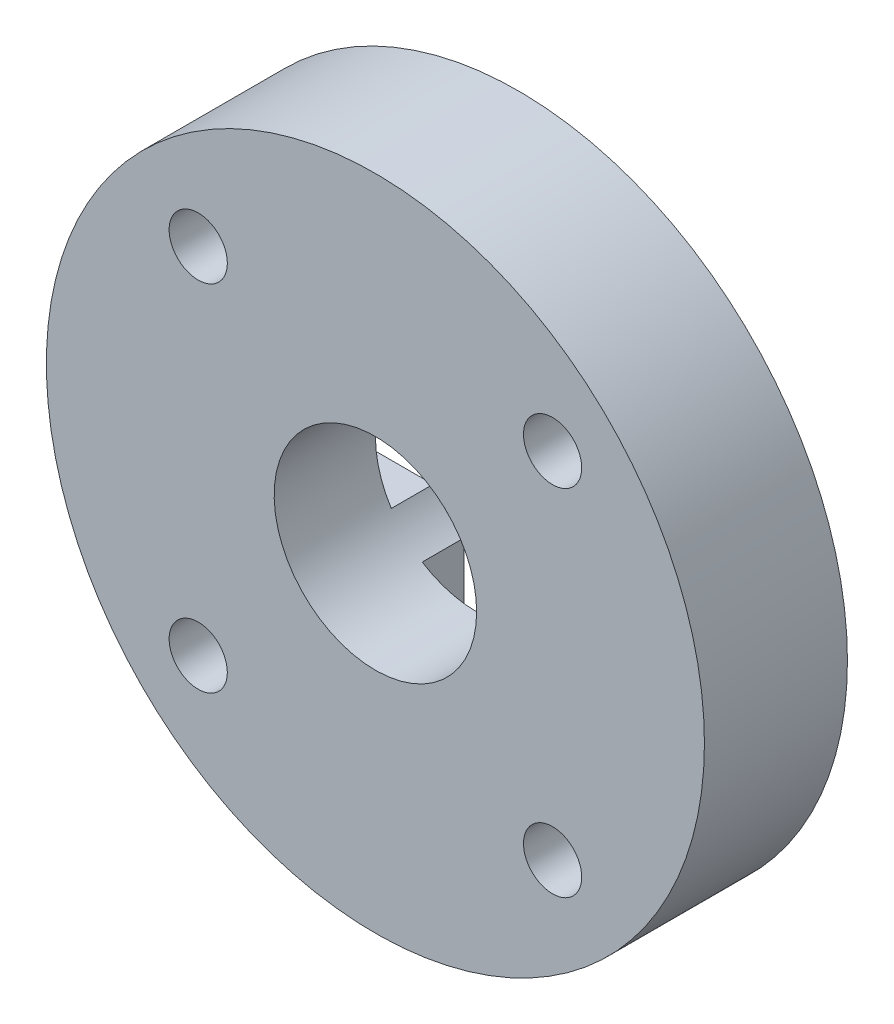
ISO-10303-21;
HEADER;
FILE_DESCRIPTION(('STEP AP214'),'2;1');
FILE_NAME('part.step','',(''),(''),'','','');
FILE_SCHEMA(('AUTOMOTIVE_DESIGN { 1 0 10303 214 1 1 1 1 }'));
ENDSEC;
DATA;
#1=APPLICATION_CONTEXT('core data for automotive mechanical design processes');
#2=APPLICATION_PROTOCOL_DEFINITION('international standard','automotive_design',2000,#1);
#3=PRODUCT_CONTEXT('',#1,'mechanical');
#4=PRODUCT('Part','Part','',(#3));
#5=PRODUCT_RELATED_PRODUCT_CATEGORY('part','',(#4));
#6=PRODUCT_DEFINITION_FORMATION('','',#4);
#7=PRODUCT_DEFINITION_CONTEXT('part definition',#1,'design');
#8=PRODUCT_DEFINITION('design','',#6,#7);
#9=PRODUCT_DEFINITION_SHAPE('','',#8);
#10=(LENGTH_UNIT() NAMED_UNIT(*) SI_UNIT(.MILLI.,.METRE.));
#11=(NAMED_UNIT(*) PLANE_ANGLE_UNIT() SI_UNIT($,.RADIAN.));
#12=(NAMED_UNIT(*) SI_UNIT($,.STERADIAN.) SOLID_ANGLE_UNIT());
#13=UNCERTAINTY_MEASURE_WITH_UNIT(LENGTH_MEASURE(1.E-05),#10,'distance_accuracy_value','');
#14=(GEOMETRIC_REPRESENTATION_CONTEXT(3) GLOBAL_UNCERTAINTY_ASSIGNED_CONTEXT((#13)) GLOBAL_UNIT_ASSIGNED_CONTEXT((#10,
#11,#12)) REPRESENTATION_CONTEXT('',''));
#15=CARTESIAN_POINT('',(0.,0.,0.));
#16=DIRECTION('',(0.,0.,1.));
#17=DIRECTION('',(1.,0.,0.));
#18=AXIS2_PLACEMENT_3D('',#15,#16,#17);
#19=CARTESIAN_POINT('',(0.,0.,-1.65));
#20=DIRECTION('',(0.,0.,1.));
#21=DIRECTION('',(1.,0.,0.));
#22=AXIS2_PLACEMENT_3D('',#19,#20,#21);
#23=PLANE('',#22);
#24=CARTESIAN_POINT('',(7.,-7.,-1.65));
#25=DIRECTION('',(0.,0.,1.));
#26=DIRECTION('',(1.,0.,0.));
#27=AXIS2_PLACEMENT_3D('',#24,#25,#26);
#28=CIRCLE('',#27,1.15);
#29=CARTESIAN_POINT('',(8.15,-7.,-1.65));
#30=VERTEX_POINT('',#29);
#31=EDGE_CURVE('E268',#30,#30,#28,.F.);
#32=ORIENTED_EDGE('',*,*,#31,.F.);
#33=EDGE_LOOP('',(#32));
#34=FACE_BOUND('',#33,.T.);
#35=CARTESIAN_POINT('',(-7.,-7.,-1.65));
#36=DIRECTION('',(0.,0.,1.));
#37=DIRECTION('',(1.,0.,0.));
#38=AXIS2_PLACEMENT_3D('',#35,#36,#37);
#39=CIRCLE('',#38,1.15);
#40=CARTESIAN_POINT('',(-5.85,-7.,-1.65));
#41=VERTEX_POINT('',#40);
#42=EDGE_CURVE('E287',#41,#41,#39,.F.);
#43=ORIENTED_EDGE('',*,*,#42,.F.);
#44=EDGE_LOOP('',(#43));
#45=FACE_BOUND('',#44,.T.);
#46=CARTESIAN_POINT('',(-7.,7.,-1.65));
#47=DIRECTION('',(0.,0.,1.));
#48=DIRECTION('',(1.,0.,0.));
#49=AXIS2_PLACEMENT_3D('',#46,#47,#48);
#50=CIRCLE('',#49,1.15);
#51=CARTESIAN_POINT('',(-5.85,7.,-1.65));
#52=VERTEX_POINT('',#51);
#53=EDGE_CURVE('E291',#52,#52,#50,.F.);
#54=ORIENTED_EDGE('',*,*,#53,.F.);
#55=EDGE_LOOP('',(#54));
#56=FACE_BOUND('',#55,.T.);
#57=CARTESIAN_POINT('',(7.,7.,-1.65));
#58=DIRECTION('',(0.,0.,1.));
#59=DIRECTION('',(1.,0.,0.));
#60=AXIS2_PLACEMENT_3D('',#57,#58,#59);
#61=CIRCLE('',#60,1.15);
#62=CARTESIAN_POINT('',(8.15,7.,-1.65));
#63=VERTEX_POINT('',#62);
#64=EDGE_CURVE('E296',#63,#63,#61,.F.);
#65=ORIENTED_EDGE('',*,*,#64,.F.);
#66=EDGE_LOOP('',(#65));
#67=FACE_BOUND('',#66,.T.);
#68=CARTESIAN_POINT('',(0.,0.,-1.65));
#69=DIRECTION('',(0.,0.,1.));
#70=DIRECTION('',(1.,0.,0.));
#71=AXIS2_PLACEMENT_3D('',#68,#69,#70);
#72=CIRCLE('',#71,13.);
#73=CARTESIAN_POINT('',(13.,0.,-1.65));
#74=VERTEX_POINT('',#73);
#75=EDGE_CURVE('E215',#74,#74,#72,.T.);
#76=ORIENTED_EDGE('',*,*,#75,.F.);
#77=EDGE_LOOP('',(#76));
#78=FACE_BOUND('',#77,.T.);
#79=DIRECTION('',(-1.,0.,0.));
#80=VECTOR('',#79,1.);
#81=CARTESIAN_POINT('',(-8.15,2.15,-1.65));
#82=LINE('',#81,#80);
#83=CARTESIAN_POINT('',(8.15,2.15,-1.65));
#84=VERTEX_POINT('',#83);
#85=CARTESIAN_POINT('',(3.37305499510459,2.15,-1.65));
#86=VERTEX_POINT('',#85);
#87=EDGE_CURVE('E173',#84,#86,#82,.T.);
#88=ORIENTED_EDGE('',*,*,#87,.T.);
#89=CARTESIAN_POINT('',(0.,0.,-1.65));
#90=DIRECTION('',(0.,0.,1.));
#91=DIRECTION('',(1.,0.,0.));
#92=AXIS2_PLACEMENT_3D('',#89,#90,#91);
#93=CIRCLE('',#92,4.);
#94=CARTESIAN_POINT('',(2.15,3.37305499510459,-1.65));
#95=VERTEX_POINT('',#94);
#96=EDGE_CURVE('E154',#86,#95,#93,.T.);
#97=ORIENTED_EDGE('',*,*,#96,.T.);
#98=DIRECTION('',(0.,1.,0.));
#99=VECTOR('',#98,1.);
#100=CARTESIAN_POINT('',(2.15,-8.15,-1.65));
#101=LINE('',#100,#99);
#102=CARTESIAN_POINT('',(2.15,8.15,-1.65));
#103=VERTEX_POINT('',#102);
#104=EDGE_CURVE('E230',#95,#103,#101,.T.);
#105=ORIENTED_EDGE('',*,*,#104,.T.);
#106=CARTESIAN_POINT('',(0.,8.15,-1.65));
#107=DIRECTION('',(0.,0.,1.));
#108=DIRECTION('',(1.,0.,0.));
#109=AXIS2_PLACEMENT_3D('',#106,#107,#108);
#110=CIRCLE('',#109,2.15);
#111=CARTESIAN_POINT('',(-2.15,8.15,-1.65));
#112=VERTEX_POINT('',#111);
#113=EDGE_CURVE('E273',#103,#112,#110,.T.);
#114=ORIENTED_EDGE('',*,*,#113,.T.);
#115=DIRECTION('',(0.,-1.,0.));
#116=VECTOR('',#115,1.);
#117=CARTESIAN_POINT('',(-2.15,-8.15,-1.65));
#118=LINE('',#117,#116);
#119=CARTESIAN_POINT('',(-2.15,3.37305499510459,-1.65));
#120=VERTEX_POINT('',#119);
#121=EDGE_CURVE('E236',#112,#120,#118,.T.);
#122=ORIENTED_EDGE('',*,*,#121,.T.);
#123=CARTESIAN_POINT('',(-3.37305499510459,2.15,-1.65));
#124=VERTEX_POINT('',#123);
#125=EDGE_CURVE('E64',#120,#124,#93,.T.);
#126=ORIENTED_EDGE('',*,*,#125,.T.);
#127=CARTESIAN_POINT('',(-8.15,2.15,-1.65));
#128=VERTEX_POINT('',#127);
#129=EDGE_CURVE('E189',#124,#128,#82,.T.);
#130=ORIENTED_EDGE('',*,*,#129,.T.);
#131=CARTESIAN_POINT('',(-8.15,0.,-1.65));
#132=DIRECTION('',(0.,0.,1.));
#133=DIRECTION('',(1.,0.,0.));
#134=AXIS2_PLACEMENT_3D('',#131,#132,#133);
#135=CIRCLE('',#134,2.15);
#136=CARTESIAN_POINT('',(-8.15,-2.15,-1.65));
#137=VERTEX_POINT('',#136);
#138=EDGE_CURVE('E278',#128,#137,#135,.T.);
#139=ORIENTED_EDGE('',*,*,#138,.T.);
#140=DIRECTION('',(1.,0.,0.));
#141=VECTOR('',#140,1.);
#142=CARTESIAN_POINT('',(-8.15,-2.15,-1.65));
#143=LINE('',#142,#141);
#144=CARTESIAN_POINT('',(-3.37305499510459,-2.15,-1.65));
#145=VERTEX_POINT('',#144);
#146=EDGE_CURVE('E191',#137,#145,#143,.T.);
#147=ORIENTED_EDGE('',*,*,#146,.T.);
#148=CARTESIAN_POINT('',(-2.15,-3.37305499510459,-1.65));
#149=VERTEX_POINT('',#148);
#150=EDGE_CURVE('E636',#145,#149,#93,.T.);
#151=ORIENTED_EDGE('',*,*,#150,.T.);
#152=CARTESIAN_POINT('',(-2.15,-8.15,-1.65));
#153=VERTEX_POINT('',#152);
#154=EDGE_CURVE('E53',#149,#153,#118,.T.);
#155=ORIENTED_EDGE('',*,*,#154,.T.);
#156=CARTESIAN_POINT('',(0.,-8.15,-1.65));
#157=DIRECTION('',(0.,0.,1.));
#158=DIRECTION('',(1.,0.,0.));
#159=AXIS2_PLACEMENT_3D('',#156,#157,#158);
#160=CIRCLE('',#159,2.15);
#161=CARTESIAN_POINT('',(2.15,-8.15,-1.65));
#162=VERTEX_POINT('',#161);
#163=EDGE_CURVE('E270',#153,#162,#160,.T.);
#164=ORIENTED_EDGE('',*,*,#163,.T.);
#165=CARTESIAN_POINT('',(2.15,-3.37305499510459,-1.65));
#166=VERTEX_POINT('',#165);
#167=EDGE_CURVE('E231',#162,#166,#101,.T.);
#168=ORIENTED_EDGE('',*,*,#167,.T.);
#169=CARTESIAN_POINT('',(3.37305499510459,-2.15,-1.65));
#170=VERTEX_POINT('',#169);
#171=EDGE_CURVE('E66',#166,#170,#93,.T.);
#172=ORIENTED_EDGE('',*,*,#171,.T.);
#173=CARTESIAN_POINT('',(8.15,-2.15,-1.65));
#174=VERTEX_POINT('',#173);
#175=EDGE_CURVE('E353',#170,#174,#143,.T.);
#176=ORIENTED_EDGE('',*,*,#175,.T.);
#177=CARTESIAN_POINT('',(8.15,0.,-1.65));
#178=DIRECTION('',(0.,0.,1.));
#179=DIRECTION('',(1.,0.,0.));
#180=AXIS2_PLACEMENT_3D('',#177,#178,#179);
#181=CIRCLE('',#180,2.15);
#182=EDGE_CURVE('E181',#174,#84,#181,.T.);
#183=ORIENTED_EDGE('',*,*,#182,.T.);
#184=EDGE_LOOP('',(#88,#97,#105,#114,#122,#126,#130,#139,#147,#151,#155,#164,#168,#172,#176,#183));
#185=FACE_BOUND('',#184,.T.);
#186=ADVANCED_FACE('F44',(#34,#45,#56,#67,#78,#185),#23,.F.);
#187=CARTESIAN_POINT('',(-8.15,-2.15,0.));
#188=DIRECTION('',(0.,1.,0.));
#189=DIRECTION('',(0.,0.,1.));
#190=AXIS2_PLACEMENT_3D('',#187,#188,#189);
#191=PLANE('',#190);
#192=ORIENTED_EDGE('',*,*,#175,.F.);
#193=DIRECTION('',(0.,0.,-1.));
#194=VECTOR('',#193,1.);
#195=CARTESIAN_POINT('',(3.37305499510459,-2.15,0.));
#196=LINE('',#195,#194);
#197=CARTESIAN_POINT('',(3.37305499510459,-2.15,0.));
#198=VERTEX_POINT('',#197);
#199=EDGE_CURVE('E176',#170,#198,#196,.F.);
#200=ORIENTED_EDGE('',*,*,#199,.T.);
#201=DIRECTION('',(1.,0.,0.));
#202=VECTOR('',#201,1.);
#203=CARTESIAN_POINT('',(-8.15,-2.15,0.));
#204=LINE('',#203,#202);
#205=CARTESIAN_POINT('',(8.15,-2.15,0.));
#206=VERTEX_POINT('',#205);
#207=EDGE_CURVE('E183',#198,#206,#204,.T.);
#208=ORIENTED_EDGE('',*,*,#207,.T.);
#209=DIRECTION('',(0.,0.,-1.));
#210=VECTOR('',#209,1.);
#211=CARTESIAN_POINT('',(8.15,-2.15,0.));
#212=LINE('',#211,#210);
#213=EDGE_CURVE('E204',#206,#174,#212,.T.);
#214=ORIENTED_EDGE('',*,*,#213,.T.);
#215=EDGE_LOOP('',(#192,#200,#208,#214));
#216=FACE_BOUND('',#215,.T.);
#217=ADVANCED_FACE('F409',(#216),#191,.T.);
#218=CARTESIAN_POINT('',(-8.15,2.15,0.));
#219=DIRECTION('',(0.,-1.,0.));
#220=DIRECTION('',(0.,0.,-1.));
#221=AXIS2_PLACEMENT_3D('',#218,#219,#220);
#222=PLANE('',#221);
#223=DIRECTION('',(-1.,0.,0.));
#224=VECTOR('',#223,1.);
#225=CARTESIAN_POINT('',(-8.15,2.15,0.));
#226=LINE('',#225,#224);
#227=CARTESIAN_POINT('',(8.15,2.15,0.));
#228=VERTEX_POINT('',#227);
#229=CARTESIAN_POINT('',(3.37305499510459,2.15,0.));
#230=VERTEX_POINT('',#229);
#231=EDGE_CURVE('E178',#228,#230,#226,.T.);
#232=ORIENTED_EDGE('',*,*,#231,.T.);
#233=DIRECTION('',(0.,0.,-1.));
#234=VECTOR('',#233,1.);
#235=CARTESIAN_POINT('',(3.37305499510459,2.15,0.));
#236=LINE('',#235,#234);
#237=EDGE_CURVE('E159',#230,#86,#236,.T.);
#238=ORIENTED_EDGE('',*,*,#237,.T.);
#239=ORIENTED_EDGE('',*,*,#87,.F.);
#240=DIRECTION('',(0.,0.,-1.));
#241=VECTOR('',#240,1.);
#242=CARTESIAN_POINT('',(8.15,2.15,0.));
#243=LINE('',#242,#241);
#244=EDGE_CURVE('E203',#228,#84,#243,.T.);
#245=ORIENTED_EDGE('',*,*,#244,.F.);
#246=EDGE_LOOP('',(#232,#238,#239,#245));
#247=FACE_BOUND('',#246,.T.);
#248=ADVANCED_FACE('F171',(#247),#222,.T.);
#249=ORIENTED_EDGE('',*,*,#129,.F.);
#250=DIRECTION('',(0.,0.,-1.));
#251=VECTOR('',#250,1.);
#252=CARTESIAN_POINT('',(-3.37305499510459,2.15,0.));
#253=LINE('',#252,#251);
#254=CARTESIAN_POINT('',(-3.37305499510459,2.15,0.));
#255=VERTEX_POINT('',#254);
#256=EDGE_CURVE('E177',#124,#255,#253,.F.);
#257=ORIENTED_EDGE('',*,*,#256,.T.);
#258=CARTESIAN_POINT('',(-8.15,2.15,0.));
#259=VERTEX_POINT('',#258);
#260=EDGE_CURVE('E359',#255,#259,#226,.T.);
#261=ORIENTED_EDGE('',*,*,#260,.T.);
#262=DIRECTION('',(0.,0.,-1.));
#263=VECTOR('',#262,1.);
#264=CARTESIAN_POINT('',(-8.15,2.15,0.));
#265=LINE('',#264,#263);
#266=EDGE_CURVE('E197',#259,#128,#265,.T.);
#267=ORIENTED_EDGE('',*,*,#266,.T.);
#268=EDGE_LOOP('',(#249,#257,#261,#267));
#269=FACE_BOUND('',#268,.T.);
#270=ADVANCED_FACE('F370',(#269),#222,.T.);
#271=CARTESIAN_POINT('',(-8.15,-2.15,0.));
#272=VERTEX_POINT('',#271);
#273=CARTESIAN_POINT('',(-3.37305499510459,-2.15,0.));
#274=VERTEX_POINT('',#273);
#275=EDGE_CURVE('E193',#272,#274,#204,.T.);
#276=ORIENTED_EDGE('',*,*,#275,.T.);
#277=DIRECTION('',(0.,0.,-1.));
#278=VECTOR('',#277,1.);
#279=CARTESIAN_POINT('',(-3.37305499510459,-2.15,0.));
#280=LINE('',#279,#278);
#281=EDGE_CURVE('E321',#274,#145,#280,.T.);
#282=ORIENTED_EDGE('',*,*,#281,.T.);
#283=ORIENTED_EDGE('',*,*,#146,.F.);
#284=DIRECTION('',(0.,0.,-1.));
#285=VECTOR('',#284,1.);
#286=CARTESIAN_POINT('',(-8.15,-2.15,0.));
#287=LINE('',#286,#285);
#288=EDGE_CURVE('E208',#272,#137,#287,.T.);
#289=ORIENTED_EDGE('',*,*,#288,.F.);
#290=EDGE_LOOP('',(#276,#282,#283,#289));
#291=FACE_BOUND('',#290,.T.);
#292=ADVANCED_FACE('F414',(#291),#191,.T.);
#293=CARTESIAN_POINT('',(2.15,-8.15,0.));
#294=DIRECTION('',(-1.,0.,0.));
#295=DIRECTION('',(0.,0.,1.));
#296=AXIS2_PLACEMENT_3D('',#293,#294,#295);
#297=PLANE('',#296);
#298=ORIENTED_EDGE('',*,*,#104,.F.);
#299=DIRECTION('',(0.,0.,-1.));
#300=VECTOR('',#299,1.);
#301=CARTESIAN_POINT('',(2.15,3.37305499510459,0.));
#302=LINE('',#301,#300);
#303=CARTESIAN_POINT('',(2.15,3.37305499510459,0.));
#304=VERTEX_POINT('',#303);
#305=EDGE_CURVE('E165',#95,#304,#302,.F.);
#306=ORIENTED_EDGE('',*,*,#305,.T.);
#307=DIRECTION('',(0.,1.,0.));
#308=VECTOR('',#307,1.);
#309=CARTESIAN_POINT('',(2.15,-8.15,0.));
#310=LINE('',#309,#308);
#311=CARTESIAN_POINT('',(2.15,8.15,0.));
#312=VERTEX_POINT('',#311);
#313=EDGE_CURVE('E257',#304,#312,#310,.T.);
#314=ORIENTED_EDGE('',*,*,#313,.T.);
#315=DIRECTION('',(0.,0.,-1.));
#316=VECTOR('',#315,1.);
#317=CARTESIAN_POINT('',(2.15,8.15,0.));
#318=LINE('',#317,#316);
#319=EDGE_CURVE('E348',#312,#103,#318,.T.);
#320=ORIENTED_EDGE('',*,*,#319,.T.);
#321=EDGE_LOOP('',(#298,#306,#314,#320));
#322=FACE_BOUND('',#321,.T.);
#323=ADVANCED_FACE('F394',(#322),#297,.T.);
#324=CARTESIAN_POINT('',(-2.15,-8.15,0.));
#325=DIRECTION('',(1.,0.,0.));
#326=DIRECTION('',(0.,0.,-1.));
#327=AXIS2_PLACEMENT_3D('',#324,#325,#326);
#328=PLANE('',#327);
#329=DIRECTION('',(0.,-1.,0.));
#330=VECTOR('',#329,1.);
#331=CARTESIAN_POINT('',(-2.15,-8.15,0.));
#332=LINE('',#331,#330);
#333=CARTESIAN_POINT('',(-2.15,8.15,0.));
#334=VERTEX_POINT('',#333);
#335=CARTESIAN_POINT('',(-2.15,3.37305499510459,0.));
#336=VERTEX_POINT('',#335);
#337=EDGE_CURVE('E246',#334,#336,#332,.T.);
#338=ORIENTED_EDGE('',*,*,#337,.T.);
#339=DIRECTION('',(0.,0.,-1.));
#340=VECTOR('',#339,1.);
#341=CARTESIAN_POINT('',(-2.15,3.37305499510459,0.));
#342=LINE('',#341,#340);
#343=EDGE_CURVE('E330',#336,#120,#342,.T.);
#344=ORIENTED_EDGE('',*,*,#343,.T.);
#345=ORIENTED_EDGE('',*,*,#121,.F.);
#346=DIRECTION('',(0.,0.,-1.));
#347=VECTOR('',#346,1.);
#348=CARTESIAN_POINT('',(-2.15,8.15,0.));
#349=LINE('',#348,#347);
#350=EDGE_CURVE('E259',#334,#112,#349,.T.);
#351=ORIENTED_EDGE('',*,*,#350,.F.);
#352=EDGE_LOOP('',(#338,#344,#345,#351));
#353=FACE_BOUND('',#352,.T.);
#354=ADVANCED_FACE('F387',(#353),#328,.T.);
#355=ORIENTED_EDGE('',*,*,#154,.F.);
#356=DIRECTION('',(0.,0.,-1.));
#357=VECTOR('',#356,1.);
#358=CARTESIAN_POINT('',(-2.15,-3.37305499510459,0.));
#359=LINE('',#358,#357);
#360=CARTESIAN_POINT('',(-2.15,-3.37305499510459,0.));
#361=VERTEX_POINT('',#360);
#362=EDGE_CURVE('E170',#149,#361,#359,.F.);
#363=ORIENTED_EDGE('',*,*,#362,.T.);
#364=CARTESIAN_POINT('',(-2.15,-8.15,0.));
#365=VERTEX_POINT('',#364);
#366=EDGE_CURVE('E241',#361,#365,#332,.T.);
#367=ORIENTED_EDGE('',*,*,#366,.T.);
#368=DIRECTION('',(0.,0.,-1.));
#369=VECTOR('',#368,1.);
#370=CARTESIAN_POINT('',(-2.15,-8.15,0.));
#371=LINE('',#370,#369);
#372=EDGE_CURVE('E349',#365,#153,#371,.T.);
#373=ORIENTED_EDGE('',*,*,#372,.T.);
#374=EDGE_LOOP('',(#355,#363,#367,#373));
#375=FACE_BOUND('',#374,.T.);
#376=ADVANCED_FACE('F331',(#375),#328,.T.);
#377=CARTESIAN_POINT('',(2.15,-8.15,0.));
#378=VERTEX_POINT('',#377);
#379=CARTESIAN_POINT('',(2.15,-3.37305499510459,0.));
#380=VERTEX_POINT('',#379);
#381=EDGE_CURVE('E258',#378,#380,#310,.T.);
#382=ORIENTED_EDGE('',*,*,#381,.T.);
#383=DIRECTION('',(0.,0.,-1.));
#384=VECTOR('',#383,1.);
#385=CARTESIAN_POINT('',(2.15,-3.37305499510459,0.));
#386=LINE('',#385,#384);
#387=EDGE_CURVE('E11',#380,#166,#386,.T.);
#388=ORIENTED_EDGE('',*,*,#387,.T.);
#389=ORIENTED_EDGE('',*,*,#167,.F.);
#390=DIRECTION('',(0.,0.,-1.));
#391=VECTOR('',#390,1.);
#392=CARTESIAN_POINT('',(2.15,-8.15,0.));
#393=LINE('',#392,#391);
#394=EDGE_CURVE('E344',#378,#162,#393,.T.);
#395=ORIENTED_EDGE('',*,*,#394,.F.);
#396=EDGE_LOOP('',(#382,#388,#389,#395));
#397=FACE_BOUND('',#396,.T.);
#398=ADVANCED_FACE('F341',(#397),#297,.T.);
#399=CARTESIAN_POINT('',(0.,0.,4.));
#400=DIRECTION('',(0.,0.,1.));
#401=DIRECTION('',(1.,0.,0.));
#402=AXIS2_PLACEMENT_3D('',#399,#400,#401);
#403=PLANE('',#402);
#404=CARTESIAN_POINT('',(7.,-7.,4.));
#405=DIRECTION('',(0.,0.,1.));
#406=DIRECTION('',(1.,0.,0.));
#407=AXIS2_PLACEMENT_3D('',#404,#405,#406);
#408=CIRCLE('',#407,1.15);
#409=CARTESIAN_POINT('',(8.15,-7.,4.));
#410=VERTEX_POINT('',#409);
#411=EDGE_CURVE('E308',#410,#410,#408,.T.);
#412=ORIENTED_EDGE('',*,*,#411,.F.);
#413=EDGE_LOOP('',(#412));
#414=FACE_BOUND('',#413,.T.);
#415=CARTESIAN_POINT('',(-7.,-7.,4.));
#416=DIRECTION('',(0.,0.,1.));
#417=DIRECTION('',(1.,0.,0.));
#418=AXIS2_PLACEMENT_3D('',#415,#416,#417);
#419=CIRCLE('',#418,1.15);
#420=CARTESIAN_POINT('',(-5.85,-7.,4.));
#421=VERTEX_POINT('',#420);
#422=EDGE_CURVE('E309',#421,#421,#419,.T.);
#423=ORIENTED_EDGE('',*,*,#422,.F.);
#424=EDGE_LOOP('',(#423));
#425=FACE_BOUND('',#424,.T.);
#426=CARTESIAN_POINT('',(-7.,7.,4.));
#427=DIRECTION('',(0.,0.,1.));
#428=DIRECTION('',(1.,0.,0.));
#429=AXIS2_PLACEMENT_3D('',#426,#427,#428);
#430=CIRCLE('',#429,1.15);
#431=CARTESIAN_POINT('',(-5.85,7.,4.));
#432=VERTEX_POINT('',#431);
#433=EDGE_CURVE('E304',#432,#432,#430,.T.);
#434=ORIENTED_EDGE('',*,*,#433,.F.);
#435=EDGE_LOOP('',(#434));
#436=FACE_BOUND('',#435,.T.);
#437=CARTESIAN_POINT('',(7.,7.,4.));
#438=DIRECTION('',(0.,0.,1.));
#439=DIRECTION('',(1.,0.,0.));
#440=AXIS2_PLACEMENT_3D('',#437,#438,#439);
#441=CIRCLE('',#440,1.15);
#442=CARTESIAN_POINT('',(8.15,7.,4.));
#443=VERTEX_POINT('',#442);
#444=EDGE_CURVE('E303',#443,#443,#441,.T.);
#445=ORIENTED_EDGE('',*,*,#444,.F.);
#446=EDGE_LOOP('',(#445));
#447=FACE_BOUND('',#446,.T.);
#448=CARTESIAN_POINT('',(0.,0.,4.));
#449=DIRECTION('',(0.,0.,1.));
#450=DIRECTION('',(1.,0.,0.));
#451=AXIS2_PLACEMENT_3D('',#448,#449,#450);
#452=CIRCLE('',#451,13.);
#453=CARTESIAN_POINT('',(13.,0.,4.));
#454=VERTEX_POINT('',#453);
#455=EDGE_CURVE('E225',#454,#454,#452,.T.);
#456=ORIENTED_EDGE('',*,*,#455,.T.);
#457=EDGE_LOOP('',(#456));
#458=FACE_BOUND('',#457,.T.);
#459=CARTESIAN_POINT('',(0.,0.,4.));
#460=DIRECTION('',(0.,0.,1.));
#461=DIRECTION('',(1.,0.,0.));
#462=AXIS2_PLACEMENT_3D('',#459,#460,#461);
#463=CIRCLE('',#462,4.);
#464=CARTESIAN_POINT('',(4.,0.,4.));
#465=VERTEX_POINT('',#464);
#466=EDGE_CURVE('E217',#465,#465,#463,.T.);
#467=ORIENTED_EDGE('',*,*,#466,.F.);
#468=EDGE_LOOP('',(#467));
#469=FACE_BOUND('',#468,.T.);
#470=ADVANCED_FACE('F421',(#414,#425,#436,#447,#458,#469),#403,.T.);
#471=CARTESIAN_POINT('',(0.,0.,4.));
#472=DIRECTION('',(0.,0.,-1.));
#473=DIRECTION('',(-1.,0.,0.));
#474=AXIS2_PLACEMENT_3D('',#471,#472,#473);
#475=CYLINDRICAL_SURFACE('',#474,13.);
#476=ORIENTED_EDGE('',*,*,#455,.F.);
#477=EDGE_LOOP('',(#476));
#478=FACE_BOUND('',#477,.T.);
#479=ORIENTED_EDGE('',*,*,#75,.T.);
#480=EDGE_LOOP('',(#479));
#481=FACE_BOUND('',#480,.T.);
#482=ADVANCED_FACE('F50',(#478,#481),#475,.T.);
#483=CARTESIAN_POINT('',(0.,0.,4.));
#484=DIRECTION('',(0.,0.,-1.));
#485=DIRECTION('',(-1.,0.,0.));
#486=AXIS2_PLACEMENT_3D('',#483,#484,#485);
#487=CYLINDRICAL_SURFACE('',#486,4.);
#488=ORIENTED_EDGE('',*,*,#466,.T.);
#489=EDGE_LOOP('',(#488));
#490=FACE_BOUND('',#489,.T.);
#491=CARTESIAN_POINT('',(0.,0.,0.));
#492=DIRECTION('',(0.,0.,1.));
#493=DIRECTION('',(1.,0.,0.));
#494=AXIS2_PLACEMENT_3D('',#491,#492,#493);
#495=CIRCLE('',#494,4.);
#496=EDGE_CURVE('E224',#304,#336,#495,.T.);
#497=ORIENTED_EDGE('',*,*,#496,.F.);
#498=ORIENTED_EDGE('',*,*,#305,.F.);
#499=ORIENTED_EDGE('',*,*,#96,.F.);
#500=ORIENTED_EDGE('',*,*,#237,.F.);
#501=EDGE_CURVE('E211',#198,#230,#495,.T.);
#502=ORIENTED_EDGE('',*,*,#501,.F.);
#503=ORIENTED_EDGE('',*,*,#199,.F.);
#504=ORIENTED_EDGE('',*,*,#171,.F.);
#505=ORIENTED_EDGE('',*,*,#387,.F.);
#506=EDGE_CURVE('E216',#361,#380,#495,.T.);
#507=ORIENTED_EDGE('',*,*,#506,.F.);
#508=ORIENTED_EDGE('',*,*,#362,.F.);
#509=ORIENTED_EDGE('',*,*,#150,.F.);
#510=ORIENTED_EDGE('',*,*,#281,.F.);
#511=EDGE_CURVE('E220',#255,#274,#495,.T.);
#512=ORIENTED_EDGE('',*,*,#511,.F.);
#513=ORIENTED_EDGE('',*,*,#256,.F.);
#514=ORIENTED_EDGE('',*,*,#125,.F.);
#515=ORIENTED_EDGE('',*,*,#343,.F.);
#516=EDGE_LOOP('',(#497,#498,#499,#500,#502,#503,#504,#505,#507,#508,#509,#510,#512,#513,#514,#515));
#517=FACE_BOUND('',#516,.T.);
#518=ADVANCED_FACE('F158',(#490,#517),#487,.F.);
#519=CARTESIAN_POINT('',(0.,0.,0.));
#520=DIRECTION('',(0.,0.,-1.));
#521=DIRECTION('',(-1.,0.,0.));
#522=AXIS2_PLACEMENT_3D('',#519,#520,#521);
#523=PLANE('',#522);
#524=ORIENTED_EDGE('',*,*,#231,.F.);
#525=CARTESIAN_POINT('',(8.15,0.,0.));
#526=DIRECTION('',(0.,0.,1.));
#527=DIRECTION('',(1.,0.,0.));
#528=AXIS2_PLACEMENT_3D('',#525,#526,#527);
#529=CIRCLE('',#528,2.15);
#530=EDGE_CURVE('E253',#206,#228,#529,.T.);
#531=ORIENTED_EDGE('',*,*,#530,.F.);
#532=ORIENTED_EDGE('',*,*,#207,.F.);
#533=ORIENTED_EDGE('',*,*,#501,.T.);
#534=EDGE_LOOP('',(#524,#531,#532,#533));
#535=FACE_BOUND('',#534,.T.);
#536=ADVANCED_FACE('F423',(#535),#523,.T.);
#537=ORIENTED_EDGE('',*,*,#275,.F.);
#538=CARTESIAN_POINT('',(-8.15,0.,0.));
#539=DIRECTION('',(0.,0.,1.));
#540=DIRECTION('',(1.,0.,0.));
#541=AXIS2_PLACEMENT_3D('',#538,#539,#540);
#542=CIRCLE('',#541,2.15);
#543=EDGE_CURVE('E280',#259,#272,#542,.T.);
#544=ORIENTED_EDGE('',*,*,#543,.F.);
#545=ORIENTED_EDGE('',*,*,#260,.F.);
#546=ORIENTED_EDGE('',*,*,#511,.T.);
#547=EDGE_LOOP('',(#537,#544,#545,#546));
#548=FACE_BOUND('',#547,.T.);
#549=ADVANCED_FACE('F373',(#548),#523,.T.);
#550=CARTESIAN_POINT('',(0.,0.,0.));
#551=DIRECTION('',(0.,0.,-1.));
#552=DIRECTION('',(-1.,0.,0.));
#553=AXIS2_PLACEMENT_3D('',#550,#551,#552);
#554=PLANE('',#553);
#555=ORIENTED_EDGE('',*,*,#337,.F.);
#556=CARTESIAN_POINT('',(0.,8.15,0.));
#557=DIRECTION('',(0.,0.,1.));
#558=DIRECTION('',(1.,0.,0.));
#559=AXIS2_PLACEMENT_3D('',#556,#557,#558);
#560=CIRCLE('',#559,2.15);
#561=EDGE_CURVE('E271',#312,#334,#560,.T.);
#562=ORIENTED_EDGE('',*,*,#561,.F.);
#563=ORIENTED_EDGE('',*,*,#313,.F.);
#564=ORIENTED_EDGE('',*,*,#496,.T.);
#565=EDGE_LOOP('',(#555,#562,#563,#564));
#566=FACE_BOUND('',#565,.T.);
#567=ADVANCED_FACE('F381',(#566),#554,.T.);
#568=ORIENTED_EDGE('',*,*,#381,.F.);
#569=CARTESIAN_POINT('',(0.,-8.15,0.));
#570=DIRECTION('',(0.,0.,1.));
#571=DIRECTION('',(1.,0.,0.));
#572=AXIS2_PLACEMENT_3D('',#569,#570,#571);
#573=CIRCLE('',#572,2.15);
#574=EDGE_CURVE('E262',#365,#378,#573,.T.);
#575=ORIENTED_EDGE('',*,*,#574,.F.);
#576=ORIENTED_EDGE('',*,*,#366,.F.);
#577=ORIENTED_EDGE('',*,*,#506,.T.);
#578=EDGE_LOOP('',(#568,#575,#576,#577));
#579=FACE_BOUND('',#578,.T.);
#580=ADVANCED_FACE('F343',(#579),#554,.T.);
#581=CARTESIAN_POINT('',(0.,-8.15,0.));
#582=DIRECTION('',(0.,0.,-1.));
#583=DIRECTION('',(-1.,0.,0.));
#584=AXIS2_PLACEMENT_3D('',#581,#582,#583);
#585=CYLINDRICAL_SURFACE('',#584,2.15);
#586=ORIENTED_EDGE('',*,*,#163,.F.);
#587=ORIENTED_EDGE('',*,*,#372,.F.);
#588=ORIENTED_EDGE('',*,*,#574,.T.);
#589=ORIENTED_EDGE('',*,*,#394,.T.);
#590=EDGE_LOOP('',(#586,#587,#588,#589));
#591=FACE_BOUND('',#590,.T.);
#592=ADVANCED_FACE('F392',(#591),#585,.F.);
#593=CARTESIAN_POINT('',(0.,8.15,0.));
#594=DIRECTION('',(0.,0.,-1.));
#595=DIRECTION('',(-1.,0.,0.));
#596=AXIS2_PLACEMENT_3D('',#593,#594,#595);
#597=CYLINDRICAL_SURFACE('',#596,2.15);
#598=ORIENTED_EDGE('',*,*,#319,.F.);
#599=ORIENTED_EDGE('',*,*,#561,.T.);
#600=ORIENTED_EDGE('',*,*,#350,.T.);
#601=ORIENTED_EDGE('',*,*,#113,.F.);
#602=EDGE_LOOP('',(#598,#599,#600,#601));
#603=FACE_BOUND('',#602,.T.);
#604=ADVANCED_FACE('F391',(#603),#597,.F.);
#605=CARTESIAN_POINT('',(-8.15,0.,0.));
#606=DIRECTION('',(0.,0.,-1.));
#607=DIRECTION('',(-1.,0.,0.));
#608=AXIS2_PLACEMENT_3D('',#605,#606,#607);
#609=CYLINDRICAL_SURFACE('',#608,2.15);
#610=ORIENTED_EDGE('',*,*,#543,.T.);
#611=ORIENTED_EDGE('',*,*,#288,.T.);
#612=ORIENTED_EDGE('',*,*,#138,.F.);
#613=ORIENTED_EDGE('',*,*,#266,.F.);
#614=EDGE_LOOP('',(#610,#611,#612,#613));
#615=FACE_BOUND('',#614,.T.);
#616=ADVANCED_FACE('F393',(#615),#609,.F.);
#617=CARTESIAN_POINT('',(8.15,0.,0.));
#618=DIRECTION('',(0.,0.,-1.));
#619=DIRECTION('',(-1.,0.,0.));
#620=AXIS2_PLACEMENT_3D('',#617,#618,#619);
#621=CYLINDRICAL_SURFACE('',#620,2.15);
#622=ORIENTED_EDGE('',*,*,#182,.F.);
#623=ORIENTED_EDGE('',*,*,#213,.F.);
#624=ORIENTED_EDGE('',*,*,#530,.T.);
#625=ORIENTED_EDGE('',*,*,#244,.T.);
#626=EDGE_LOOP('',(#622,#623,#624,#625));
#627=FACE_BOUND('',#626,.T.);
#628=ADVANCED_FACE('F402',(#627),#621,.F.);
#629=CARTESIAN_POINT('',(7.,7.,4.));
#630=DIRECTION('',(0.,0.,-1.));
#631=DIRECTION('',(-1.,0.,0.));
#632=AXIS2_PLACEMENT_3D('',#629,#630,#631);
#633=CYLINDRICAL_SURFACE('',#632,1.15);
#634=ORIENTED_EDGE('',*,*,#444,.T.);
#635=EDGE_LOOP('',(#634));
#636=FACE_BOUND('',#635,.T.);
#637=ORIENTED_EDGE('',*,*,#64,.T.);
#638=EDGE_LOOP('',(#637));
#639=FACE_BOUND('',#638,.T.);
#640=ADVANCED_FACE('F441',(#636,#639),#633,.F.);
#641=CARTESIAN_POINT('',(-7.,7.,4.));
#642=DIRECTION('',(0.,0.,-1.));
#643=DIRECTION('',(-1.,0.,0.));
#644=AXIS2_PLACEMENT_3D('',#641,#642,#643);
#645=CYLINDRICAL_SURFACE('',#644,1.15);
#646=ORIENTED_EDGE('',*,*,#433,.T.);
#647=EDGE_LOOP('',(#646));
#648=FACE_BOUND('',#647,.T.);
#649=ORIENTED_EDGE('',*,*,#53,.T.);
#650=EDGE_LOOP('',(#649));
#651=FACE_BOUND('',#650,.T.);
#652=ADVANCED_FACE('F449',(#648,#651),#645,.F.);
#653=CARTESIAN_POINT('',(-7.,-7.,4.));
#654=DIRECTION('',(0.,0.,-1.));
#655=DIRECTION('',(-1.,0.,0.));
#656=AXIS2_PLACEMENT_3D('',#653,#654,#655);
#657=CYLINDRICAL_SURFACE('',#656,1.15);
#658=ORIENTED_EDGE('',*,*,#422,.T.);
#659=EDGE_LOOP('',(#658));
#660=FACE_BOUND('',#659,.T.);
#661=ORIENTED_EDGE('',*,*,#42,.T.);
#662=EDGE_LOOP('',(#661));
#663=FACE_BOUND('',#662,.T.);
#664=ADVANCED_FACE('F457',(#660,#663),#657,.F.);
#665=CARTESIAN_POINT('',(7.,-7.,4.));
#666=DIRECTION('',(0.,0.,-1.));
#667=DIRECTION('',(-1.,0.,0.));
#668=AXIS2_PLACEMENT_3D('',#665,#666,#667);
#669=CYLINDRICAL_SURFACE('',#668,1.15);
#670=ORIENTED_EDGE('',*,*,#411,.T.);
#671=EDGE_LOOP('',(#670));
#672=FACE_BOUND('',#671,.T.);
#673=ORIENTED_EDGE('',*,*,#31,.T.);
#674=EDGE_LOOP('',(#673));
#675=FACE_BOUND('',#674,.T.);
#676=ADVANCED_FACE('F461',(#672,#675),#669,.F.);
#677=CLOSED_SHELL('',(#186,#217,#248,#270,#292,#323,#354,#376,#398,#470,#482,#518,#536,#549,
#567,#580,#592,#604,#616,#628,#640,#652,#664,#676));
#678=MANIFOLD_SOLID_BREP('B2',#677);
#679=ADVANCED_BREP_SHAPE_REPRESENTATION('',(#18,#678),#14);
#680=SHAPE_DEFINITION_REPRESENTATION(#9,#679);
ENDSEC;
END-ISO-10303-21;
